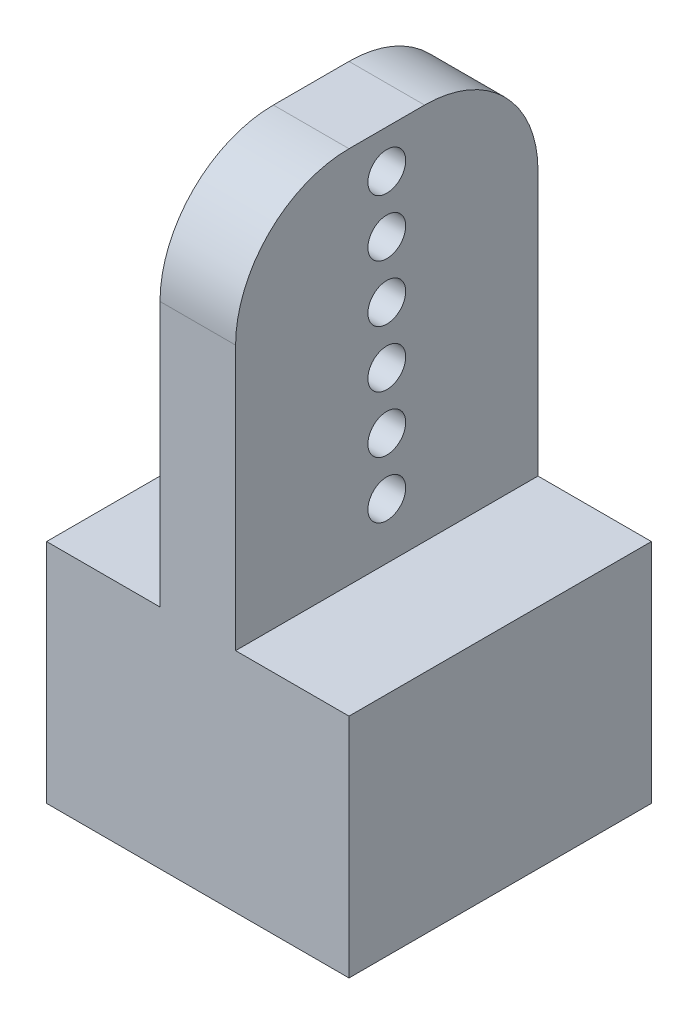
ISO-10303-21;
HEADER;
FILE_DESCRIPTION(('STEP AP214'),'2;1');
FILE_NAME('part.step','',(''),(''),'','','');
FILE_SCHEMA(('AUTOMOTIVE_DESIGN { 1 0 10303 214 1 1 1 1 }'));
ENDSEC;
DATA;
#1=APPLICATION_CONTEXT('core data for automotive mechanical design processes');
#2=APPLICATION_PROTOCOL_DEFINITION('international standard','automotive_design',2000,#1);
#3=PRODUCT_CONTEXT('',#1,'mechanical');
#4=PRODUCT('Part','Part','',(#3));
#5=PRODUCT_RELATED_PRODUCT_CATEGORY('part','',(#4));
#6=PRODUCT_DEFINITION_FORMATION('','',#4);
#7=PRODUCT_DEFINITION_CONTEXT('part definition',#1,'design');
#8=PRODUCT_DEFINITION('design','',#6,#7);
#9=PRODUCT_DEFINITION_SHAPE('','',#8);
#10=(LENGTH_UNIT() NAMED_UNIT(*) SI_UNIT(.MILLI.,.METRE.));
#11=(NAMED_UNIT(*) PLANE_ANGLE_UNIT() SI_UNIT($,.RADIAN.));
#12=(NAMED_UNIT(*) SI_UNIT($,.STERADIAN.) SOLID_ANGLE_UNIT());
#13=UNCERTAINTY_MEASURE_WITH_UNIT(LENGTH_MEASURE(1.E-05),#10,'distance_accuracy_value','');
#14=(GEOMETRIC_REPRESENTATION_CONTEXT(3) GLOBAL_UNCERTAINTY_ASSIGNED_CONTEXT((#13)) GLOBAL_UNIT_ASSIGNED_CONTEXT((#10,
#11,#12)) REPRESENTATION_CONTEXT('',''));
#15=CARTESIAN_POINT('',(0.,0.,0.));
#16=DIRECTION('',(0.,0.,1.));
#17=DIRECTION('',(1.,0.,0.));
#18=AXIS2_PLACEMENT_3D('',#15,#16,#17);
#19=CARTESIAN_POINT('',(-20.,74.9071536011516,0.));
#20=DIRECTION('',(1.,0.,0.));
#21=DIRECTION('',(0.,0.,-1.));
#22=AXIS2_PLACEMENT_3D('',#19,#20,#21);
#23=CYLINDRICAL_SURFACE('',#22,2.5);
#24=CARTESIAN_POINT('',(5.,74.9071536011516,0.));
#25=DIRECTION('',(1.,0.,0.));
#26=DIRECTION('',(0.,0.,-1.));
#27=AXIS2_PLACEMENT_3D('',#24,#25,#26);
#28=CIRCLE('',#27,2.5);
#29=CARTESIAN_POINT('',(5.,74.9071536011516,-2.5));
#30=VERTEX_POINT('',#29);
#31=EDGE_CURVE('E260',#30,#30,#28,.T.);
#32=ORIENTED_EDGE('',*,*,#31,.T.);
#33=EDGE_LOOP('',(#32));
#34=FACE_BOUND('',#33,.T.);
#35=CARTESIAN_POINT('',(-5.,74.9071536011516,0.));
#36=DIRECTION('',(1.,0.,0.));
#37=DIRECTION('',(0.,0.,-1.));
#38=AXIS2_PLACEMENT_3D('',#35,#36,#37);
#39=CIRCLE('',#38,2.5);
#40=CARTESIAN_POINT('',(-5.,74.9071536011516,-2.5));
#41=VERTEX_POINT('',#40);
#42=EDGE_CURVE('E263',#41,#41,#39,.T.);
#43=ORIENTED_EDGE('',*,*,#42,.F.);
#44=EDGE_LOOP('',(#43));
#45=FACE_BOUND('',#44,.T.);
#46=ADVANCED_FACE('F36',(#34,#45),#23,.F.);
#47=CARTESIAN_POINT('',(-20.,67.4071536011516,0.));
#48=DIRECTION('',(1.,0.,0.));
#49=DIRECTION('',(0.,0.,-1.));
#50=AXIS2_PLACEMENT_3D('',#47,#48,#49);
#51=CYLINDRICAL_SURFACE('',#50,2.5);
#52=CARTESIAN_POINT('',(5.,67.4071536011516,0.));
#53=DIRECTION('',(1.,0.,0.));
#54=DIRECTION('',(0.,0.,-1.));
#55=AXIS2_PLACEMENT_3D('',#52,#53,#54);
#56=CIRCLE('',#55,2.5);
#57=CARTESIAN_POINT('',(5.,67.4071536011516,-2.5));
#58=VERTEX_POINT('',#57);
#59=EDGE_CURVE('E254',#58,#58,#56,.T.);
#60=ORIENTED_EDGE('',*,*,#59,.T.);
#61=EDGE_LOOP('',(#60));
#62=FACE_BOUND('',#61,.T.);
#63=CARTESIAN_POINT('',(-5.,67.4071536011516,0.));
#64=DIRECTION('',(1.,0.,0.));
#65=DIRECTION('',(0.,0.,-1.));
#66=AXIS2_PLACEMENT_3D('',#63,#64,#65);
#67=CIRCLE('',#66,2.5);
#68=CARTESIAN_POINT('',(-5.,67.4071536011516,-2.5));
#69=VERTEX_POINT('',#68);
#70=EDGE_CURVE('E257',#69,#69,#67,.T.);
#71=ORIENTED_EDGE('',*,*,#70,.F.);
#72=EDGE_LOOP('',(#71));
#73=FACE_BOUND('',#72,.T.);
#74=ADVANCED_FACE('F337',(#62,#73),#51,.F.);
#75=CARTESIAN_POINT('',(-20.,59.9071536011516,0.));
#76=DIRECTION('',(1.,0.,0.));
#77=DIRECTION('',(0.,0.,-1.));
#78=AXIS2_PLACEMENT_3D('',#75,#76,#77);
#79=CYLINDRICAL_SURFACE('',#78,2.5);
#80=CARTESIAN_POINT('',(5.,59.9071536011516,0.));
#81=DIRECTION('',(1.,0.,0.));
#82=DIRECTION('',(0.,0.,-1.));
#83=AXIS2_PLACEMENT_3D('',#80,#81,#82);
#84=CIRCLE('',#83,2.5);
#85=CARTESIAN_POINT('',(5.,59.9071536011516,-2.5));
#86=VERTEX_POINT('',#85);
#87=EDGE_CURVE('E248',#86,#86,#84,.T.);
#88=ORIENTED_EDGE('',*,*,#87,.T.);
#89=EDGE_LOOP('',(#88));
#90=FACE_BOUND('',#89,.T.);
#91=CARTESIAN_POINT('',(-5.,59.9071536011516,0.));
#92=DIRECTION('',(1.,0.,0.));
#93=DIRECTION('',(0.,0.,-1.));
#94=AXIS2_PLACEMENT_3D('',#91,#92,#93);
#95=CIRCLE('',#94,2.5);
#96=CARTESIAN_POINT('',(-5.,59.9071536011516,-2.5));
#97=VERTEX_POINT('',#96);
#98=EDGE_CURVE('E251',#97,#97,#95,.T.);
#99=ORIENTED_EDGE('',*,*,#98,.F.);
#100=EDGE_LOOP('',(#99));
#101=FACE_BOUND('',#100,.T.);
#102=ADVANCED_FACE('F343',(#90,#101),#79,.F.);
#103=CARTESIAN_POINT('',(-20.,52.4071536011516,0.));
#104=DIRECTION('',(1.,0.,0.));
#105=DIRECTION('',(0.,0.,-1.));
#106=AXIS2_PLACEMENT_3D('',#103,#104,#105);
#107=CYLINDRICAL_SURFACE('',#106,2.5);
#108=CARTESIAN_POINT('',(5.,52.4071536011516,0.));
#109=DIRECTION('',(1.,0.,0.));
#110=DIRECTION('',(0.,0.,-1.));
#111=AXIS2_PLACEMENT_3D('',#108,#109,#110);
#112=CIRCLE('',#111,2.5);
#113=CARTESIAN_POINT('',(5.,52.4071536011516,-2.5));
#114=VERTEX_POINT('',#113);
#115=EDGE_CURVE('E240',#114,#114,#112,.T.);
#116=ORIENTED_EDGE('',*,*,#115,.T.);
#117=EDGE_LOOP('',(#116));
#118=FACE_BOUND('',#117,.T.);
#119=CARTESIAN_POINT('',(-5.,52.4071536011516,0.));
#120=DIRECTION('',(1.,0.,0.));
#121=DIRECTION('',(0.,0.,-1.));
#122=AXIS2_PLACEMENT_3D('',#119,#120,#121);
#123=CIRCLE('',#122,2.5);
#124=CARTESIAN_POINT('',(-5.,52.4071536011516,-2.5));
#125=VERTEX_POINT('',#124);
#126=EDGE_CURVE('E245',#125,#125,#123,.T.);
#127=ORIENTED_EDGE('',*,*,#126,.F.);
#128=EDGE_LOOP('',(#127));
#129=FACE_BOUND('',#128,.T.);
#130=ADVANCED_FACE('F477',(#118,#129),#107,.F.);
#131=CARTESIAN_POINT('',(0.,30.,0.));
#132=DIRECTION('',(0.,1.,0.));
#133=DIRECTION('',(0.,0.,1.));
#134=AXIS2_PLACEMENT_3D('',#131,#132,#133);
#135=PLANE('',#134);
#136=DIRECTION('',(0.,0.,-1.));
#137=VECTOR('',#136,1.);
#138=CARTESIAN_POINT('',(5.,30.,20.));
#139=LINE('',#138,#137);
#140=CARTESIAN_POINT('',(5.,30.,20.));
#141=VERTEX_POINT('',#140);
#142=CARTESIAN_POINT('',(5.,30.,-20.));
#143=VERTEX_POINT('',#142);
#144=EDGE_CURVE('E195',#141,#143,#139,.T.);
#145=ORIENTED_EDGE('',*,*,#144,.F.);
#146=DIRECTION('',(1.,0.,0.));
#147=VECTOR('',#146,1.);
#148=CARTESIAN_POINT('',(0.,30.,20.));
#149=LINE('',#148,#147);
#150=CARTESIAN_POINT('',(20.,30.,20.));
#151=VERTEX_POINT('',#150);
#152=EDGE_CURVE('E218',#141,#151,#149,.T.);
#153=ORIENTED_EDGE('',*,*,#152,.T.);
#154=DIRECTION('',(0.,0.,1.));
#155=VECTOR('',#154,1.);
#156=CARTESIAN_POINT('',(20.,30.,0.));
#157=LINE('',#156,#155);
#158=CARTESIAN_POINT('',(20.,30.,-20.));
#159=VERTEX_POINT('',#158);
#160=EDGE_CURVE('E208',#159,#151,#157,.T.);
#161=ORIENTED_EDGE('',*,*,#160,.F.);
#162=DIRECTION('',(1.,0.,0.));
#163=VECTOR('',#162,1.);
#164=CARTESIAN_POINT('',(0.,30.,-20.));
#165=LINE('',#164,#163);
#166=EDGE_CURVE('E211',#143,#159,#165,.T.);
#167=ORIENTED_EDGE('',*,*,#166,.F.);
#168=EDGE_LOOP('',(#145,#153,#161,#167));
#169=FACE_BOUND('',#168,.T.);
#170=ADVANCED_FACE('F315',(#169),#135,.T.);
#171=CARTESIAN_POINT('',(20.,30.,0.));
#172=DIRECTION('',(1.,0.,0.));
#173=DIRECTION('',(0.,0.,-1.));
#174=AXIS2_PLACEMENT_3D('',#171,#172,#173);
#175=PLANE('',#174);
#176=DIRECTION('',(0.,0.,1.));
#177=VECTOR('',#176,1.);
#178=CARTESIAN_POINT('',(20.,0.,0.));
#179=LINE('',#178,#177);
#180=CARTESIAN_POINT('',(20.,0.,-20.));
#181=VERTEX_POINT('',#180);
#182=CARTESIAN_POINT('',(20.,0.,20.));
#183=VERTEX_POINT('',#182);
#184=EDGE_CURVE('E207',#181,#183,#179,.T.);
#185=ORIENTED_EDGE('',*,*,#184,.F.);
#186=DIRECTION('',(0.,-1.,0.));
#187=VECTOR('',#186,1.);
#188=CARTESIAN_POINT('',(20.,30.,-20.));
#189=LINE('',#188,#187);
#190=EDGE_CURVE('E238',#159,#181,#189,.T.);
#191=ORIENTED_EDGE('',*,*,#190,.F.);
#192=ORIENTED_EDGE('',*,*,#160,.T.);
#193=DIRECTION('',(0.,-1.,0.));
#194=VECTOR('',#193,1.);
#195=CARTESIAN_POINT('',(20.,30.,20.));
#196=LINE('',#195,#194);
#197=EDGE_CURVE('E222',#151,#183,#196,.T.);
#198=ORIENTED_EDGE('',*,*,#197,.T.);
#199=EDGE_LOOP('',(#185,#191,#192,#198));
#200=FACE_BOUND('',#199,.T.);
#201=ADVANCED_FACE('F320',(#200),#175,.T.);
#202=CARTESIAN_POINT('',(0.,30.,-20.));
#203=DIRECTION('',(0.,0.,-1.));
#204=DIRECTION('',(-1.,0.,0.));
#205=AXIS2_PLACEMENT_3D('',#202,#203,#204);
#206=PLANE('',#205);
#207=DIRECTION('',(0.,1.,0.));
#208=VECTOR('',#207,1.);
#209=CARTESIAN_POINT('',(-15.,26.,-20.));
#210=LINE('',#209,#208);
#211=CARTESIAN_POINT('',(-15.,4.,-20.));
#212=VERTEX_POINT('',#211);
#213=CARTESIAN_POINT('',(-15.,26.,-20.));
#214=VERTEX_POINT('',#213);
#215=EDGE_CURVE('E51',#212,#214,#210,.T.);
#216=ORIENTED_EDGE('',*,*,#215,.F.);
#217=DIRECTION('',(-1.,0.,0.));
#218=VECTOR('',#217,1.);
#219=CARTESIAN_POINT('',(15.,4.,-20.));
#220=LINE('',#219,#218);
#221=CARTESIAN_POINT('',(15.,4.,-20.));
#222=VERTEX_POINT('',#221);
#223=EDGE_CURVE('E156',#222,#212,#220,.T.);
#224=ORIENTED_EDGE('',*,*,#223,.F.);
#225=DIRECTION('',(0.,-1.,0.));
#226=VECTOR('',#225,1.);
#227=CARTESIAN_POINT('',(15.,26.,-20.));
#228=LINE('',#227,#226);
#229=CARTESIAN_POINT('',(15.,26.,-20.));
#230=VERTEX_POINT('',#229);
#231=EDGE_CURVE('E159',#230,#222,#228,.T.);
#232=ORIENTED_EDGE('',*,*,#231,.F.);
#233=DIRECTION('',(1.,0.,0.));
#234=VECTOR('',#233,1.);
#235=CARTESIAN_POINT('',(15.,26.,-20.));
#236=LINE('',#235,#234);
#237=EDGE_CURVE('E168',#214,#230,#236,.T.);
#238=ORIENTED_EDGE('',*,*,#237,.F.);
#239=EDGE_LOOP('',(#216,#224,#232,#238));
#240=FACE_BOUND('',#239,.T.);
#241=DIRECTION('',(0.,-1.,0.));
#242=VECTOR('',#241,1.);
#243=CARTESIAN_POINT('',(-5.,80.,-20.));
#244=LINE('',#243,#242);
#245=CARTESIAN_POINT('',(-5.,65.,-20.));
#246=VERTEX_POINT('',#245);
#247=CARTESIAN_POINT('',(-5.,30.,-20.));
#248=VERTEX_POINT('',#247);
#249=EDGE_CURVE('E203',#246,#248,#244,.T.);
#250=ORIENTED_EDGE('',*,*,#249,.F.);
#251=DIRECTION('',(-1.,0.,0.));
#252=VECTOR('',#251,1.);
#253=CARTESIAN_POINT('',(5.,65.,-20.));
#254=LINE('',#253,#252);
#255=CARTESIAN_POINT('',(5.,65.,-20.));
#256=VERTEX_POINT('',#255);
#257=EDGE_CURVE('E276',#246,#256,#254,.F.);
#258=ORIENTED_EDGE('',*,*,#257,.T.);
#259=DIRECTION('',(0.,-1.,0.));
#260=VECTOR('',#259,1.);
#261=CARTESIAN_POINT('',(5.,80.,-20.));
#262=LINE('',#261,#260);
#263=EDGE_CURVE('E205',#256,#143,#262,.T.);
#264=ORIENTED_EDGE('',*,*,#263,.T.);
#265=ORIENTED_EDGE('',*,*,#166,.T.);
#266=ORIENTED_EDGE('',*,*,#190,.T.);
#267=DIRECTION('',(1.,0.,0.));
#268=VECTOR('',#267,1.);
#269=CARTESIAN_POINT('',(0.,0.,-20.));
#270=LINE('',#269,#268);
#271=CARTESIAN_POINT('',(-20.,0.,-20.));
#272=VERTEX_POINT('',#271);
#273=EDGE_CURVE('E225',#272,#181,#270,.T.);
#274=ORIENTED_EDGE('',*,*,#273,.F.);
#275=DIRECTION('',(0.,-1.,0.));
#276=VECTOR('',#275,1.);
#277=CARTESIAN_POINT('',(-20.,30.,-20.));
#278=LINE('',#277,#276);
#279=CARTESIAN_POINT('',(-20.,30.,-20.));
#280=VERTEX_POINT('',#279);
#281=EDGE_CURVE('E236',#280,#272,#278,.T.);
#282=ORIENTED_EDGE('',*,*,#281,.F.);
#283=EDGE_CURVE('E213',#280,#248,#165,.T.);
#284=ORIENTED_EDGE('',*,*,#283,.T.);
#285=EDGE_LOOP('',(#250,#258,#264,#265,#266,#274,#282,#284));
#286=FACE_BOUND('',#285,.T.);
#287=ADVANCED_FACE('F296',(#240,#286),#206,.T.);
#288=CARTESIAN_POINT('',(-20.,30.,0.));
#289=DIRECTION('',(1.,0.,0.));
#290=DIRECTION('',(0.,0.,-1.));
#291=AXIS2_PLACEMENT_3D('',#288,#289,#290);
#292=PLANE('',#291);
#293=DIRECTION('',(0.,0.,1.));
#294=VECTOR('',#293,1.);
#295=CARTESIAN_POINT('',(-20.,0.,0.));
#296=LINE('',#295,#294);
#297=CARTESIAN_POINT('',(-20.,0.,20.));
#298=VERTEX_POINT('',#297);
#299=EDGE_CURVE('E228',#272,#298,#296,.T.);
#300=ORIENTED_EDGE('',*,*,#299,.T.);
#301=DIRECTION('',(0.,-1.,0.));
#302=VECTOR('',#301,1.);
#303=CARTESIAN_POINT('',(-20.,30.,20.));
#304=LINE('',#303,#302);
#305=CARTESIAN_POINT('',(-20.,30.,20.));
#306=VERTEX_POINT('',#305);
#307=EDGE_CURVE('E233',#306,#298,#304,.T.);
#308=ORIENTED_EDGE('',*,*,#307,.F.);
#309=DIRECTION('',(0.,0.,1.));
#310=VECTOR('',#309,1.);
#311=CARTESIAN_POINT('',(-20.,30.,0.));
#312=LINE('',#311,#310);
#313=EDGE_CURVE('E216',#280,#306,#312,.T.);
#314=ORIENTED_EDGE('',*,*,#313,.F.);
#315=ORIENTED_EDGE('',*,*,#281,.T.);
#316=EDGE_LOOP('',(#300,#308,#314,#315));
#317=FACE_BOUND('',#316,.T.);
#318=ADVANCED_FACE('F326',(#317),#292,.F.);
#319=CARTESIAN_POINT('',(0.,30.,20.));
#320=DIRECTION('',(0.,0.,-1.));
#321=DIRECTION('',(-1.,0.,0.));
#322=AXIS2_PLACEMENT_3D('',#319,#320,#321);
#323=PLANE('',#322);
#324=DIRECTION('',(0.,-1.,0.));
#325=VECTOR('',#324,1.);
#326=CARTESIAN_POINT('',(5.,80.,20.));
#327=LINE('',#326,#325);
#328=CARTESIAN_POINT('',(5.,65.,20.));
#329=VERTEX_POINT('',#328);
#330=EDGE_CURVE('E194',#329,#141,#327,.T.);
#331=ORIENTED_EDGE('',*,*,#330,.F.);
#332=DIRECTION('',(1.,0.,0.));
#333=VECTOR('',#332,1.);
#334=CARTESIAN_POINT('',(0.,65.,20.));
#335=LINE('',#334,#333);
#336=CARTESIAN_POINT('',(-5.,65.,20.));
#337=VERTEX_POINT('',#336);
#338=EDGE_CURVE('E11',#329,#337,#335,.F.);
#339=ORIENTED_EDGE('',*,*,#338,.T.);
#340=DIRECTION('',(0.,-1.,0.));
#341=VECTOR('',#340,1.);
#342=CARTESIAN_POINT('',(-5.,80.,20.));
#343=LINE('',#342,#341);
#344=CARTESIAN_POINT('',(-5.,30.,20.));
#345=VERTEX_POINT('',#344);
#346=EDGE_CURVE('E201',#337,#345,#343,.T.);
#347=ORIENTED_EDGE('',*,*,#346,.T.);
#348=EDGE_CURVE('E219',#306,#345,#149,.T.);
#349=ORIENTED_EDGE('',*,*,#348,.F.);
#350=ORIENTED_EDGE('',*,*,#307,.T.);
#351=DIRECTION('',(1.,0.,0.));
#352=VECTOR('',#351,1.);
#353=CARTESIAN_POINT('',(0.,0.,20.));
#354=LINE('',#353,#352);
#355=EDGE_CURVE('E212',#298,#183,#354,.T.);
#356=ORIENTED_EDGE('',*,*,#355,.T.);
#357=ORIENTED_EDGE('',*,*,#197,.F.);
#358=ORIENTED_EDGE('',*,*,#152,.F.);
#359=EDGE_LOOP('',(#331,#339,#347,#349,#350,#356,#357,#358));
#360=FACE_BOUND('',#359,.T.);
#361=ADVANCED_FACE('F309',(#360),#323,.F.);
#362=DIRECTION('',(0.,0.,1.));
#363=VECTOR('',#362,1.);
#364=CARTESIAN_POINT('',(-5.,30.,20.));
#365=LINE('',#364,#363);
#366=EDGE_CURVE('E191',#248,#345,#365,.T.);
#367=ORIENTED_EDGE('',*,*,#366,.F.);
#368=ORIENTED_EDGE('',*,*,#283,.F.);
#369=ORIENTED_EDGE('',*,*,#313,.T.);
#370=ORIENTED_EDGE('',*,*,#348,.T.);
#371=EDGE_LOOP('',(#367,#368,#369,#370));
#372=FACE_BOUND('',#371,.T.);
#373=ADVANCED_FACE('F301',(#372),#135,.T.);
#374=CARTESIAN_POINT('',(0.,0.,0.));
#375=DIRECTION('',(0.,1.,0.));
#376=DIRECTION('',(0.,0.,1.));
#377=AXIS2_PLACEMENT_3D('',#374,#375,#376);
#378=PLANE('',#377);
#379=CARTESIAN_POINT('',(7.5,0.,-1.99999999999999));
#380=DIRECTION('',(0.,-1.,0.));
#381=DIRECTION('',(0.,0.,-1.));
#382=AXIS2_PLACEMENT_3D('',#379,#380,#381);
#383=CIRCLE('',#382,2.74999999999999);
#384=CARTESIAN_POINT('',(7.5,0.,-4.74999999999999));
#385=VERTEX_POINT('',#384);
#386=EDGE_CURVE('E383',#385,#385,#383,.T.);
#387=ORIENTED_EDGE('',*,*,#386,.F.);
#388=EDGE_LOOP('',(#387));
#389=FACE_BOUND('',#388,.T.);
#390=CARTESIAN_POINT('',(-7.5,0.,-1.99999999999999));
#391=DIRECTION('',(0.,-1.,0.));
#392=DIRECTION('',(0.,0.,-1.));
#393=AXIS2_PLACEMENT_3D('',#390,#391,#392);
#394=CIRCLE('',#393,2.75000000000001);
#395=CARTESIAN_POINT('',(-7.5,0.,-4.75));
#396=VERTEX_POINT('',#395);
#397=EDGE_CURVE('E386',#396,#396,#394,.T.);
#398=ORIENTED_EDGE('',*,*,#397,.F.);
#399=EDGE_LOOP('',(#398));
#400=FACE_BOUND('',#399,.T.);
#401=ORIENTED_EDGE('',*,*,#184,.T.);
#402=ORIENTED_EDGE('',*,*,#355,.F.);
#403=ORIENTED_EDGE('',*,*,#299,.F.);
#404=ORIENTED_EDGE('',*,*,#273,.T.);
#405=EDGE_LOOP('',(#401,#402,#403,#404));
#406=FACE_BOUND('',#405,.T.);
#407=ADVANCED_FACE('F324',(#389,#400,#406),#378,.F.);
#408=CARTESIAN_POINT('',(5.,80.,20.));
#409=DIRECTION('',(-1.,0.,0.));
#410=DIRECTION('',(0.,0.,1.));
#411=AXIS2_PLACEMENT_3D('',#408,#409,#410);
#412=PLANE('',#411);
#413=CARTESIAN_POINT('',(5.,44.9071536011516,0.));
#414=DIRECTION('',(1.,0.,0.));
#415=DIRECTION('',(0.,0.,-1.));
#416=AXIS2_PLACEMENT_3D('',#413,#414,#415);
#417=CIRCLE('',#416,2.5);
#418=CARTESIAN_POINT('',(5.,44.9071536011516,-2.5));
#419=VERTEX_POINT('',#418);
#420=EDGE_CURVE('E174',#419,#419,#417,.T.);
#421=ORIENTED_EDGE('',*,*,#420,.F.);
#422=EDGE_LOOP('',(#421));
#423=FACE_BOUND('',#422,.T.);
#424=CARTESIAN_POINT('',(5.,37.4071536011516,0.));
#425=DIRECTION('',(1.,0.,0.));
#426=DIRECTION('',(0.,0.,-1.));
#427=AXIS2_PLACEMENT_3D('',#424,#425,#426);
#428=CIRCLE('',#427,2.5);
#429=CARTESIAN_POINT('',(5.,37.4071536011516,-2.5));
#430=VERTEX_POINT('',#429);
#431=EDGE_CURVE('E183',#430,#430,#428,.T.);
#432=ORIENTED_EDGE('',*,*,#431,.F.);
#433=EDGE_LOOP('',(#432));
#434=FACE_BOUND('',#433,.T.);
#435=ORIENTED_EDGE('',*,*,#263,.F.);
#436=CARTESIAN_POINT('',(5.,65.,-5.));
#437=DIRECTION('',(-1.,0.,0.));
#438=DIRECTION('',(0.,0.,1.));
#439=AXIS2_PLACEMENT_3D('',#436,#437,#438);
#440=CIRCLE('',#439,15.);
#441=CARTESIAN_POINT('',(5.,80.,-5.));
#442=VERTEX_POINT('',#441);
#443=EDGE_CURVE('E44',#256,#442,#440,.F.);
#444=ORIENTED_EDGE('',*,*,#443,.T.);
#445=DIRECTION('',(0.,0.,-1.));
#446=VECTOR('',#445,1.);
#447=CARTESIAN_POINT('',(5.,80.,20.));
#448=LINE('',#447,#446);
#449=CARTESIAN_POINT('',(5.,80.,5.));
#450=VERTEX_POINT('',#449);
#451=EDGE_CURVE('E187',#450,#442,#448,.T.);
#452=ORIENTED_EDGE('',*,*,#451,.F.);
#453=CARTESIAN_POINT('',(5.,65.,5.));
#454=DIRECTION('',(-1.,0.,0.));
#455=DIRECTION('',(0.,0.,1.));
#456=AXIS2_PLACEMENT_3D('',#453,#454,#455);
#457=CIRCLE('',#456,15.);
#458=EDGE_CURVE('E59',#450,#329,#457,.F.);
#459=ORIENTED_EDGE('',*,*,#458,.T.);
#460=ORIENTED_EDGE('',*,*,#330,.T.);
#461=ORIENTED_EDGE('',*,*,#144,.T.);
#462=EDGE_LOOP('',(#435,#444,#452,#459,#460,#461));
#463=FACE_BOUND('',#462,.T.);
#464=ORIENTED_EDGE('',*,*,#115,.F.);
#465=EDGE_LOOP('',(#464));
#466=FACE_BOUND('',#465,.T.);
#467=ORIENTED_EDGE('',*,*,#87,.F.);
#468=EDGE_LOOP('',(#467));
#469=FACE_BOUND('',#468,.T.);
#470=ORIENTED_EDGE('',*,*,#59,.F.);
#471=EDGE_LOOP('',(#470));
#472=FACE_BOUND('',#471,.T.);
#473=ORIENTED_EDGE('',*,*,#31,.F.);
#474=EDGE_LOOP('',(#473));
#475=FACE_BOUND('',#474,.T.);
#476=ADVANCED_FACE('F280',(#423,#434,#463,#466,#469,#472,#475),#412,.F.);
#477=CARTESIAN_POINT('',(-5.,80.,20.));
#478=DIRECTION('',(1.,0.,0.));
#479=DIRECTION('',(0.,0.,-1.));
#480=AXIS2_PLACEMENT_3D('',#477,#478,#479);
#481=PLANE('',#480);
#482=CARTESIAN_POINT('',(-5.,44.9071536011516,0.));
#483=DIRECTION('',(1.,0.,0.));
#484=DIRECTION('',(0.,0.,-1.));
#485=AXIS2_PLACEMENT_3D('',#482,#483,#484);
#486=CIRCLE('',#485,2.5);
#487=CARTESIAN_POINT('',(-5.,44.9071536011516,-2.5));
#488=VERTEX_POINT('',#487);
#489=EDGE_CURVE('E180',#488,#488,#486,.T.);
#490=ORIENTED_EDGE('',*,*,#489,.T.);
#491=EDGE_LOOP('',(#490));
#492=FACE_BOUND('',#491,.T.);
#493=CARTESIAN_POINT('',(-5.,37.4071536011516,0.));
#494=DIRECTION('',(1.,0.,0.));
#495=DIRECTION('',(0.,0.,-1.));
#496=AXIS2_PLACEMENT_3D('',#493,#494,#495);
#497=CIRCLE('',#496,2.5);
#498=CARTESIAN_POINT('',(-5.,37.4071536011516,-2.5));
#499=VERTEX_POINT('',#498);
#500=EDGE_CURVE('E186',#499,#499,#497,.T.);
#501=ORIENTED_EDGE('',*,*,#500,.T.);
#502=EDGE_LOOP('',(#501));
#503=FACE_BOUND('',#502,.T.);
#504=DIRECTION('',(0.,0.,1.));
#505=VECTOR('',#504,1.);
#506=CARTESIAN_POINT('',(-5.,80.,20.));
#507=LINE('',#506,#505);
#508=CARTESIAN_POINT('',(-5.,80.,-5.));
#509=VERTEX_POINT('',#508);
#510=CARTESIAN_POINT('',(-5.,80.,5.));
#511=VERTEX_POINT('',#510);
#512=EDGE_CURVE('E190',#509,#511,#507,.T.);
#513=ORIENTED_EDGE('',*,*,#512,.F.);
#514=CARTESIAN_POINT('',(-5.,65.,-5.));
#515=DIRECTION('',(1.,0.,0.));
#516=DIRECTION('',(0.,0.,-1.));
#517=AXIS2_PLACEMENT_3D('',#514,#515,#516);
#518=CIRCLE('',#517,15.);
#519=EDGE_CURVE('E274',#509,#246,#518,.F.);
#520=ORIENTED_EDGE('',*,*,#519,.T.);
#521=ORIENTED_EDGE('',*,*,#249,.T.);
#522=ORIENTED_EDGE('',*,*,#366,.T.);
#523=ORIENTED_EDGE('',*,*,#346,.F.);
#524=CARTESIAN_POINT('',(-5.,65.,5.));
#525=DIRECTION('',(1.,0.,0.));
#526=DIRECTION('',(0.,0.,-1.));
#527=AXIS2_PLACEMENT_3D('',#524,#525,#526);
#528=CIRCLE('',#527,15.);
#529=EDGE_CURVE('E272',#337,#511,#528,.F.);
#530=ORIENTED_EDGE('',*,*,#529,.T.);
#531=EDGE_LOOP('',(#513,#520,#521,#522,#523,#530));
#532=FACE_BOUND('',#531,.T.);
#533=ORIENTED_EDGE('',*,*,#126,.T.);
#534=EDGE_LOOP('',(#533));
#535=FACE_BOUND('',#534,.T.);
#536=ORIENTED_EDGE('',*,*,#98,.T.);
#537=EDGE_LOOP('',(#536));
#538=FACE_BOUND('',#537,.T.);
#539=ORIENTED_EDGE('',*,*,#70,.T.);
#540=EDGE_LOOP('',(#539));
#541=FACE_BOUND('',#540,.T.);
#542=ORIENTED_EDGE('',*,*,#42,.T.);
#543=EDGE_LOOP('',(#542));
#544=FACE_BOUND('',#543,.T.);
#545=ADVANCED_FACE('F292',(#492,#503,#532,#535,#538,#541,#544),#481,.F.);
#546=CARTESIAN_POINT('',(0.,80.,0.));
#547=DIRECTION('',(0.,-1.,0.));
#548=DIRECTION('',(0.,0.,-1.));
#549=AXIS2_PLACEMENT_3D('',#546,#547,#548);
#550=PLANE('',#549);
#551=ORIENTED_EDGE('',*,*,#451,.T.);
#552=DIRECTION('',(-1.,0.,0.));
#553=VECTOR('',#552,1.);
#554=CARTESIAN_POINT('',(-5.,80.,-5.));
#555=LINE('',#554,#553);
#556=EDGE_CURVE('E269',#442,#509,#555,.T.);
#557=ORIENTED_EDGE('',*,*,#556,.T.);
#558=ORIENTED_EDGE('',*,*,#512,.T.);
#559=DIRECTION('',(1.,0.,0.));
#560=VECTOR('',#559,1.);
#561=CARTESIAN_POINT('',(0.,80.,5.));
#562=LINE('',#561,#560);
#563=EDGE_CURVE('E266',#511,#450,#562,.T.);
#564=ORIENTED_EDGE('',*,*,#563,.T.);
#565=EDGE_LOOP('',(#551,#557,#558,#564));
#566=FACE_BOUND('',#565,.T.);
#567=ADVANCED_FACE('F286',(#566),#550,.F.);
#568=CARTESIAN_POINT('',(-20.,37.4071536011516,0.));
#569=DIRECTION('',(1.,0.,0.));
#570=DIRECTION('',(0.,0.,-1.));
#571=AXIS2_PLACEMENT_3D('',#568,#569,#570);
#572=CYLINDRICAL_SURFACE('',#571,2.5);
#573=ORIENTED_EDGE('',*,*,#431,.T.);
#574=EDGE_LOOP('',(#573));
#575=FACE_BOUND('',#574,.T.);
#576=ORIENTED_EDGE('',*,*,#500,.F.);
#577=EDGE_LOOP('',(#576));
#578=FACE_BOUND('',#577,.T.);
#579=ADVANCED_FACE('F354',(#575,#578),#572,.F.);
#580=CARTESIAN_POINT('',(-20.,44.9071536011516,0.));
#581=DIRECTION('',(1.,0.,0.));
#582=DIRECTION('',(0.,0.,-1.));
#583=AXIS2_PLACEMENT_3D('',#580,#581,#582);
#584=CYLINDRICAL_SURFACE('',#583,2.5);
#585=ORIENTED_EDGE('',*,*,#420,.T.);
#586=EDGE_LOOP('',(#585));
#587=FACE_BOUND('',#586,.T.);
#588=ORIENTED_EDGE('',*,*,#489,.F.);
#589=EDGE_LOOP('',(#588));
#590=FACE_BOUND('',#589,.T.);
#591=ADVANCED_FACE('F349',(#587,#590),#584,.F.);
#592=CARTESIAN_POINT('',(0.,65.,-5.));
#593=DIRECTION('',(1.,0.,0.));
#594=DIRECTION('',(0.,0.,-1.));
#595=AXIS2_PLACEMENT_3D('',#592,#593,#594);
#596=CYLINDRICAL_SURFACE('',#595,15.);
#597=ORIENTED_EDGE('',*,*,#443,.F.);
#598=ORIENTED_EDGE('',*,*,#257,.F.);
#599=ORIENTED_EDGE('',*,*,#519,.F.);
#600=ORIENTED_EDGE('',*,*,#556,.F.);
#601=EDGE_LOOP('',(#597,#598,#599,#600));
#602=FACE_BOUND('',#601,.T.);
#603=ADVANCED_FACE('F289',(#602),#596,.T.);
#604=CARTESIAN_POINT('',(0.,65.,5.));
#605=DIRECTION('',(1.,0.,0.));
#606=DIRECTION('',(0.,0.,-1.));
#607=AXIS2_PLACEMENT_3D('',#604,#605,#606);
#608=CYLINDRICAL_SURFACE('',#607,15.);
#609=ORIENTED_EDGE('',*,*,#529,.F.);
#610=ORIENTED_EDGE('',*,*,#338,.F.);
#611=ORIENTED_EDGE('',*,*,#458,.F.);
#612=ORIENTED_EDGE('',*,*,#563,.F.);
#613=EDGE_LOOP('',(#609,#610,#611,#612));
#614=FACE_BOUND('',#613,.T.);
#615=ADVANCED_FACE('F38',(#614),#608,.T.);
#616=CARTESIAN_POINT('',(-15.,26.,10.));
#617=DIRECTION('',(-1.,0.,0.));
#618=DIRECTION('',(0.,-1.,0.));
#619=AXIS2_PLACEMENT_3D('',#616,#617,#618);
#620=PLANE('',#619);
#621=ORIENTED_EDGE('',*,*,#215,.T.);
#622=DIRECTION('',(0.,0.,-1.));
#623=VECTOR('',#622,1.);
#624=CARTESIAN_POINT('',(-15.,26.,10.));
#625=LINE('',#624,#623);
#626=CARTESIAN_POINT('',(-15.,26.,10.));
#627=VERTEX_POINT('',#626);
#628=EDGE_CURVE('E134',#627,#214,#625,.T.);
#629=ORIENTED_EDGE('',*,*,#628,.F.);
#630=DIRECTION('',(0.,1.,0.));
#631=VECTOR('',#630,1.);
#632=CARTESIAN_POINT('',(-15.,26.,10.));
#633=LINE('',#632,#631);
#634=CARTESIAN_POINT('',(-15.,4.,10.));
#635=VERTEX_POINT('',#634);
#636=EDGE_CURVE('E138',#635,#627,#633,.T.);
#637=ORIENTED_EDGE('',*,*,#636,.F.);
#638=DIRECTION('',(0.,0.,-1.));
#639=VECTOR('',#638,1.);
#640=CARTESIAN_POINT('',(-15.,4.,10.));
#641=LINE('',#640,#639);
#642=EDGE_CURVE('E172',#635,#212,#641,.T.);
#643=ORIENTED_EDGE('',*,*,#642,.T.);
#644=EDGE_LOOP('',(#621,#629,#637,#643));
#645=FACE_BOUND('',#644,.T.);
#646=ADVANCED_FACE('F136',(#645),#620,.F.);
#647=CARTESIAN_POINT('',(15.,4.,10.));
#648=DIRECTION('',(0.,-1.,0.));
#649=DIRECTION('',(0.,0.,-1.));
#650=AXIS2_PLACEMENT_3D('',#647,#648,#649);
#651=PLANE('',#650);
#652=CARTESIAN_POINT('',(7.5,4.,-1.99999999999999));
#653=DIRECTION('',(0.,-1.,0.));
#654=DIRECTION('',(0.,0.,-1.));
#655=AXIS2_PLACEMENT_3D('',#652,#653,#654);
#656=CIRCLE('',#655,2.74999999999999);
#657=CARTESIAN_POINT('',(7.5,4.,-4.74999999999999));
#658=VERTEX_POINT('',#657);
#659=EDGE_CURVE('E388',#658,#658,#656,.F.);
#660=ORIENTED_EDGE('',*,*,#659,.F.);
#661=EDGE_LOOP('',(#660));
#662=FACE_BOUND('',#661,.T.);
#663=CARTESIAN_POINT('',(-7.5,4.,-1.99999999999999));
#664=DIRECTION('',(0.,-1.,0.));
#665=DIRECTION('',(0.,0.,-1.));
#666=AXIS2_PLACEMENT_3D('',#663,#664,#665);
#667=CIRCLE('',#666,2.75000000000001);
#668=CARTESIAN_POINT('',(-7.5,4.,-4.75));
#669=VERTEX_POINT('',#668);
#670=EDGE_CURVE('E162',#669,#669,#667,.F.);
#671=ORIENTED_EDGE('',*,*,#670,.F.);
#672=EDGE_LOOP('',(#671));
#673=FACE_BOUND('',#672,.T.);
#674=ORIENTED_EDGE('',*,*,#223,.T.);
#675=ORIENTED_EDGE('',*,*,#642,.F.);
#676=DIRECTION('',(-1.,0.,0.));
#677=VECTOR('',#676,1.);
#678=CARTESIAN_POINT('',(15.,4.,10.));
#679=LINE('',#678,#677);
#680=CARTESIAN_POINT('',(15.,4.,10.));
#681=VERTEX_POINT('',#680);
#682=EDGE_CURVE('E144',#681,#635,#679,.T.);
#683=ORIENTED_EDGE('',*,*,#682,.F.);
#684=DIRECTION('',(0.,0.,-1.));
#685=VECTOR('',#684,1.);
#686=CARTESIAN_POINT('',(15.,4.,10.));
#687=LINE('',#686,#685);
#688=EDGE_CURVE('E175',#681,#222,#687,.T.);
#689=ORIENTED_EDGE('',*,*,#688,.T.);
#690=EDGE_LOOP('',(#674,#675,#683,#689));
#691=FACE_BOUND('',#690,.T.);
#692=ADVANCED_FACE('F401',(#662,#673,#691),#651,.F.);
#693=CARTESIAN_POINT('',(15.,26.,10.));
#694=DIRECTION('',(1.,0.,0.));
#695=DIRECTION('',(0.,1.,0.));
#696=AXIS2_PLACEMENT_3D('',#693,#694,#695);
#697=PLANE('',#696);
#698=ORIENTED_EDGE('',*,*,#231,.T.);
#699=ORIENTED_EDGE('',*,*,#688,.F.);
#700=DIRECTION('',(0.,-1.,0.));
#701=VECTOR('',#700,1.);
#702=CARTESIAN_POINT('',(15.,26.,10.));
#703=LINE('',#702,#701);
#704=CARTESIAN_POINT('',(15.,26.,10.));
#705=VERTEX_POINT('',#704);
#706=EDGE_CURVE('E152',#705,#681,#703,.T.);
#707=ORIENTED_EDGE('',*,*,#706,.F.);
#708=DIRECTION('',(0.,0.,-1.));
#709=VECTOR('',#708,1.);
#710=CARTESIAN_POINT('',(15.,26.,10.));
#711=LINE('',#710,#709);
#712=EDGE_CURVE('E143',#705,#230,#711,.T.);
#713=ORIENTED_EDGE('',*,*,#712,.T.);
#714=EDGE_LOOP('',(#698,#699,#707,#713));
#715=FACE_BOUND('',#714,.T.);
#716=ADVANCED_FACE('F404',(#715),#697,.F.);
#717=CARTESIAN_POINT('',(15.,26.,10.));
#718=DIRECTION('',(0.,1.,0.));
#719=DIRECTION('',(0.,0.,1.));
#720=AXIS2_PLACEMENT_3D('',#717,#718,#719);
#721=PLANE('',#720);
#722=ORIENTED_EDGE('',*,*,#237,.T.);
#723=ORIENTED_EDGE('',*,*,#712,.F.);
#724=DIRECTION('',(1.,0.,0.));
#725=VECTOR('',#724,1.);
#726=CARTESIAN_POINT('',(15.,26.,10.));
#727=LINE('',#726,#725);
#728=EDGE_CURVE('E147',#627,#705,#727,.T.);
#729=ORIENTED_EDGE('',*,*,#728,.F.);
#730=ORIENTED_EDGE('',*,*,#628,.T.);
#731=EDGE_LOOP('',(#722,#723,#729,#730));
#732=FACE_BOUND('',#731,.T.);
#733=ADVANCED_FACE('F148',(#732),#721,.F.);
#734=CARTESIAN_POINT('',(0.,0.,10.));
#735=DIRECTION('',(0.,0.,-1.));
#736=DIRECTION('',(-1.,0.,0.));
#737=AXIS2_PLACEMENT_3D('',#734,#735,#736);
#738=PLANE('',#737);
#739=ORIENTED_EDGE('',*,*,#636,.T.);
#740=ORIENTED_EDGE('',*,*,#728,.T.);
#741=ORIENTED_EDGE('',*,*,#706,.T.);
#742=ORIENTED_EDGE('',*,*,#682,.T.);
#743=EDGE_LOOP('',(#739,#740,#741,#742));
#744=FACE_BOUND('',#743,.T.);
#745=ADVANCED_FACE('F154',(#744),#738,.T.);
#746=CARTESIAN_POINT('',(-7.5,80.001,-1.99999999999999));
#747=DIRECTION('',(0.,-1.,0.));
#748=DIRECTION('',(0.,0.,-1.));
#749=AXIS2_PLACEMENT_3D('',#746,#747,#748);
#750=CYLINDRICAL_SURFACE('',#749,2.75000000000001);
#751=ORIENTED_EDGE('',*,*,#397,.T.);
#752=EDGE_LOOP('',(#751));
#753=FACE_BOUND('',#752,.T.);
#754=ORIENTED_EDGE('',*,*,#670,.T.);
#755=EDGE_LOOP('',(#754));
#756=FACE_BOUND('',#755,.T.);
#757=ADVANCED_FACE('F397',(#753,#756),#750,.F.);
#758=CARTESIAN_POINT('',(7.5,80.001,-1.99999999999999));
#759=DIRECTION('',(0.,-1.,0.));
#760=DIRECTION('',(0.,0.,-1.));
#761=AXIS2_PLACEMENT_3D('',#758,#759,#760);
#762=CYLINDRICAL_SURFACE('',#761,2.74999999999999);
#763=ORIENTED_EDGE('',*,*,#386,.T.);
#764=EDGE_LOOP('',(#763));
#765=FACE_BOUND('',#764,.T.);
#766=ORIENTED_EDGE('',*,*,#659,.T.);
#767=EDGE_LOOP('',(#766));
#768=FACE_BOUND('',#767,.T.);
#769=ADVANCED_FACE('F394',(#765,#768),#762,.F.);
#770=CLOSED_SHELL('',(#46,#74,#102,#130,#170,#201,#287,#318,#361,#373,#407,#476,#545,#567,#579,
#591,#603,#615,#646,#692,#716,#733,#745,#757,#769));
#771=MANIFOLD_SOLID_BREP('B2',#770);
#772=ADVANCED_BREP_SHAPE_REPRESENTATION('',(#18,#771),#14);
#773=SHAPE_DEFINITION_REPRESENTATION(#9,#772);
ENDSEC;
END-ISO-10303-21;
